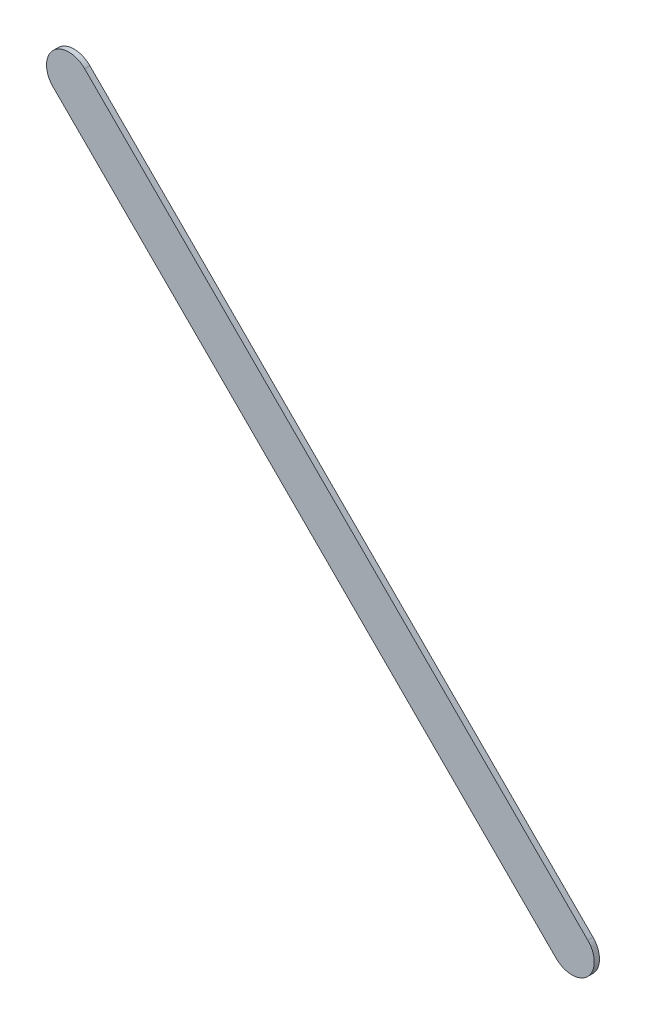
ISO-10303-21;
HEADER;
FILE_DESCRIPTION(('STEP AP214'),'2;1');
FILE_NAME('part.step','',(''),(''),'','','');
FILE_SCHEMA(('AUTOMOTIVE_DESIGN { 1 0 10303 214 1 1 1 1 }'));
ENDSEC;
DATA;
#1=APPLICATION_CONTEXT('core data for automotive mechanical design processes');
#2=APPLICATION_PROTOCOL_DEFINITION('international standard','automotive_design',2000,#1);
#3=PRODUCT_CONTEXT('',#1,'mechanical');
#4=PRODUCT('Part','Part','',(#3));
#5=PRODUCT_RELATED_PRODUCT_CATEGORY('part','',(#4));
#6=PRODUCT_DEFINITION_FORMATION('','',#4);
#7=PRODUCT_DEFINITION_CONTEXT('part definition',#1,'design');
#8=PRODUCT_DEFINITION('design','',#6,#7);
#9=PRODUCT_DEFINITION_SHAPE('','',#8);
#10=(LENGTH_UNIT() NAMED_UNIT(*) SI_UNIT(.MILLI.,.METRE.));
#11=(NAMED_UNIT(*) PLANE_ANGLE_UNIT() SI_UNIT($,.RADIAN.));
#12=(NAMED_UNIT(*) SI_UNIT($,.STERADIAN.) SOLID_ANGLE_UNIT());
#13=UNCERTAINTY_MEASURE_WITH_UNIT(LENGTH_MEASURE(1.E-05),#10,'distance_accuracy_value','');
#14=(GEOMETRIC_REPRESENTATION_CONTEXT(3) GLOBAL_UNCERTAINTY_ASSIGNED_CONTEXT((#13)) GLOBAL_UNIT_ASSIGNED_CONTEXT((#10,
#11,#12)) REPRESENTATION_CONTEXT('',''));
#15=CARTESIAN_POINT('',(0.,0.,0.));
#16=DIRECTION('',(0.,0.,1.));
#17=DIRECTION('',(1.,0.,0.));
#18=AXIS2_PLACEMENT_3D('',#15,#16,#17);
#19=CARTESIAN_POINT('',(124.476066,-62.763933,1.635));
#20=DIRECTION('',(0.,0.,1.));
#21=DIRECTION('',(1.,0.,0.));
#22=AXIS2_PLACEMENT_3D('',#19,#20,#21);
#23=PLANE('',#22);
#24=DIRECTION('',(-0.707106781186548,0.707106781186548,0.));
#25=VECTOR('',#24,1.);
#26=CARTESIAN_POINT('',(124.476066,-62.763933,1.635));
#27=LINE('',#26,#25);
#28=CARTESIAN_POINT('',(124.476066,-62.763933,1.635));
#29=VERTEX_POINT('',#28);
#30=CARTESIAN_POINT('',(121.096066,-59.383933,1.635));
#31=VERTEX_POINT('',#30);
#32=EDGE_CURVE('E90',#29,#31,#27,.T.);
#33=ORIENTED_EDGE('',*,*,#32,.T.);
#34=CARTESIAN_POINT('',(120.9899995,-59.4899995,1.635));
#35=DIRECTION('',(0.,0.,1.));
#36=DIRECTION('',(0.707106781186548,0.707106781186548,0.));
#37=AXIS2_PLACEMENT_3D('',#34,#35,#36);
#38=CIRCLE('',#37,0.150000682813);
#39=CARTESIAN_POINT('',(120.883933,-59.596066,1.635));
#40=VERTEX_POINT('',#39);
#41=EDGE_CURVE('E85',#31,#40,#38,.T.);
#42=ORIENTED_EDGE('',*,*,#41,.T.);
#43=DIRECTION('',(0.707106781186548,-0.707106781186548,0.));
#44=VECTOR('',#43,1.);
#45=CARTESIAN_POINT('',(120.883933,-59.596066,1.635));
#46=LINE('',#45,#44);
#47=CARTESIAN_POINT('',(124.263933,-62.976066,1.635));
#48=VERTEX_POINT('',#47);
#49=EDGE_CURVE('E111',#40,#48,#46,.T.);
#50=ORIENTED_EDGE('',*,*,#49,.T.);
#51=CARTESIAN_POINT('',(124.3699995,-62.8699995,1.635));
#52=DIRECTION('',(0.,0.,1.));
#53=DIRECTION('',(-0.707106781186548,-0.707106781186548,0.));
#54=AXIS2_PLACEMENT_3D('',#51,#52,#53);
#55=CIRCLE('',#54,0.150000682813);
#56=EDGE_CURVE('E11',#48,#29,#55,.T.);
#57=ORIENTED_EDGE('',*,*,#56,.T.);
#58=EDGE_LOOP('',(#33,#42,#50,#57));
#59=FACE_BOUND('',#58,.T.);
#60=ADVANCED_FACE('F17',(#59),#23,.T.);
#61=CARTESIAN_POINT('',(124.476066,-62.763933,1.6));
#62=DIRECTION('',(0.,0.,1.));
#63=DIRECTION('',(1.,0.,0.));
#64=AXIS2_PLACEMENT_3D('',#61,#62,#63);
#65=PLANE('',#64);
#66=CARTESIAN_POINT('',(124.3699995,-62.8699995,1.6));
#67=DIRECTION('',(0.,0.,1.));
#68=DIRECTION('',(-0.707106781186548,-0.707106781186548,0.));
#69=AXIS2_PLACEMENT_3D('',#66,#67,#68);
#70=CIRCLE('',#69,0.150000682813);
#71=CARTESIAN_POINT('',(124.263933,-62.976066,1.6));
#72=VERTEX_POINT('',#71);
#73=CARTESIAN_POINT('',(124.476066,-62.763933,1.6));
#74=VERTEX_POINT('',#73);
#75=EDGE_CURVE('E20',#72,#74,#70,.T.);
#76=ORIENTED_EDGE('',*,*,#75,.F.);
#77=DIRECTION('',(0.707106781186548,-0.707106781186548,0.));
#78=VECTOR('',#77,1.);
#79=CARTESIAN_POINT('',(120.883933,-59.596066,1.6));
#80=LINE('',#79,#78);
#81=CARTESIAN_POINT('',(120.883933,-59.596066,1.6));
#82=VERTEX_POINT('',#81);
#83=EDGE_CURVE('E73',#82,#72,#80,.T.);
#84=ORIENTED_EDGE('',*,*,#83,.F.);
#85=CARTESIAN_POINT('',(120.9899995,-59.4899995,1.6));
#86=DIRECTION('',(0.,0.,1.));
#87=DIRECTION('',(0.707106781186548,0.707106781186548,0.));
#88=AXIS2_PLACEMENT_3D('',#85,#86,#87);
#89=CIRCLE('',#88,0.150000682813);
#90=CARTESIAN_POINT('',(121.096066,-59.383933,1.6));
#91=VERTEX_POINT('',#90);
#92=EDGE_CURVE('E67',#91,#82,#89,.T.);
#93=ORIENTED_EDGE('',*,*,#92,.F.);
#94=DIRECTION('',(-0.707106781186548,0.707106781186548,0.));
#95=VECTOR('',#94,1.);
#96=CARTESIAN_POINT('',(124.476066,-62.763933,1.6));
#97=LINE('',#96,#95);
#98=EDGE_CURVE('E71',#74,#91,#97,.T.);
#99=ORIENTED_EDGE('',*,*,#98,.F.);
#100=EDGE_LOOP('',(#76,#84,#93,#99));
#101=FACE_BOUND('',#100,.T.);
#102=ADVANCED_FACE('F69',(#101),#65,.F.);
#103=CARTESIAN_POINT('',(124.3699995,-62.8699995,1.6));
#104=DIRECTION('',(0.,0.,-1.));
#105=DIRECTION('',(-0.707106781186548,-0.707106781186548,0.));
#106=AXIS2_PLACEMENT_3D('',#103,#104,#105);
#107=CYLINDRICAL_SURFACE('',#106,0.150000682813);
#108=ORIENTED_EDGE('',*,*,#75,.T.);
#109=DIRECTION('',(0.,0.,1.));
#110=VECTOR('',#109,1.);
#111=CARTESIAN_POINT('',(124.476066,-62.763933,1.6));
#112=LINE('',#111,#110);
#113=EDGE_CURVE('E79',#74,#29,#112,.T.);
#114=ORIENTED_EDGE('',*,*,#113,.T.);
#115=ORIENTED_EDGE('',*,*,#56,.F.);
#116=DIRECTION('',(0.,0.,1.));
#117=VECTOR('',#116,1.);
#118=CARTESIAN_POINT('',(124.263933,-62.976066,1.6));
#119=LINE('',#118,#117);
#120=EDGE_CURVE('E102',#72,#48,#119,.T.);
#121=ORIENTED_EDGE('',*,*,#120,.F.);
#122=EDGE_LOOP('',(#108,#114,#115,#121));
#123=FACE_BOUND('',#122,.T.);
#124=ADVANCED_FACE('F120',(#123),#107,.T.);
#125=CARTESIAN_POINT('',(120.883933,-59.596066,1.6));
#126=DIRECTION('',(0.707106781186548,0.707106781186548,0.));
#127=DIRECTION('',(0.,0.,-1.));
#128=AXIS2_PLACEMENT_3D('',#125,#126,#127);
#129=PLANE('',#128);
#130=ORIENTED_EDGE('',*,*,#83,.T.);
#131=ORIENTED_EDGE('',*,*,#120,.T.);
#132=ORIENTED_EDGE('',*,*,#49,.F.);
#133=DIRECTION('',(0.,0.,1.));
#134=VECTOR('',#133,1.);
#135=CARTESIAN_POINT('',(120.883933,-59.596066,1.6));
#136=LINE('',#135,#134);
#137=EDGE_CURVE('E78',#82,#40,#136,.T.);
#138=ORIENTED_EDGE('',*,*,#137,.F.);
#139=EDGE_LOOP('',(#130,#131,#132,#138));
#140=FACE_BOUND('',#139,.T.);
#141=ADVANCED_FACE('F119',(#140),#129,.F.);
#142=CARTESIAN_POINT('',(120.9899995,-59.4899995,1.6));
#143=DIRECTION('',(0.,0.,-1.));
#144=DIRECTION('',(0.707106781186548,0.707106781186548,0.));
#145=AXIS2_PLACEMENT_3D('',#142,#143,#144);
#146=CYLINDRICAL_SURFACE('',#145,0.150000682813);
#147=ORIENTED_EDGE('',*,*,#92,.T.);
#148=ORIENTED_EDGE('',*,*,#137,.T.);
#149=ORIENTED_EDGE('',*,*,#41,.F.);
#150=DIRECTION('',(0.,0.,1.));
#151=VECTOR('',#150,1.);
#152=CARTESIAN_POINT('',(121.096066,-59.383933,1.6));
#153=LINE('',#152,#151);
#154=EDGE_CURVE('E82',#91,#31,#153,.T.);
#155=ORIENTED_EDGE('',*,*,#154,.F.);
#156=EDGE_LOOP('',(#147,#148,#149,#155));
#157=FACE_BOUND('',#156,.T.);
#158=ADVANCED_FACE('F83',(#157),#146,.T.);
#159=CARTESIAN_POINT('',(124.476066,-62.763933,1.6));
#160=DIRECTION('',(-0.707106781186548,-0.707106781186548,0.));
#161=DIRECTION('',(-0.707106781186548,0.707106781186548,0.));
#162=AXIS2_PLACEMENT_3D('',#159,#160,#161);
#163=PLANE('',#162);
#164=ORIENTED_EDGE('',*,*,#98,.T.);
#165=ORIENTED_EDGE('',*,*,#154,.T.);
#166=ORIENTED_EDGE('',*,*,#32,.F.);
#167=ORIENTED_EDGE('',*,*,#113,.F.);
#168=EDGE_LOOP('',(#164,#165,#166,#167));
#169=FACE_BOUND('',#168,.T.);
#170=ADVANCED_FACE('F93',(#169),#163,.F.);
#171=CLOSED_SHELL('',(#60,#102,#124,#141,#158,#170));
#172=MANIFOLD_SOLID_BREP('B1',#171);
#173=ADVANCED_BREP_SHAPE_REPRESENTATION('',(#18,#172),#14);
#174=SHAPE_DEFINITION_REPRESENTATION(#9,#173);
ENDSEC;
END-ISO-10303-21;
